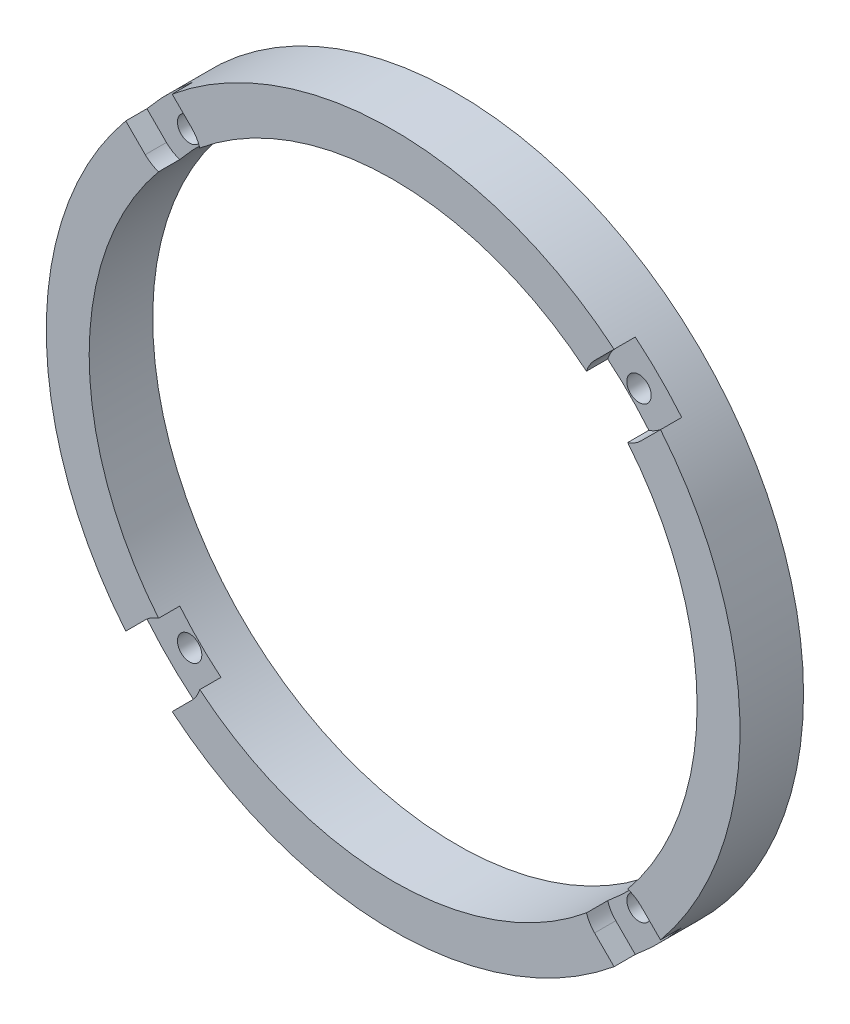
ISO-10303-21;
HEADER;
FILE_DESCRIPTION(('STEP AP214'),'2;1');
FILE_NAME('part.step','',(''),(''),'','','');
FILE_SCHEMA(('AUTOMOTIVE_DESIGN { 1 0 10303 214 1 1 1 1 }'));
ENDSEC;
DATA;
#1=APPLICATION_CONTEXT('core data for automotive mechanical design processes');
#2=APPLICATION_PROTOCOL_DEFINITION('international standard','automotive_design',2000,#1);
#3=PRODUCT_CONTEXT('',#1,'mechanical');
#4=PRODUCT('Part','Part','',(#3));
#5=PRODUCT_RELATED_PRODUCT_CATEGORY('part','',(#4));
#6=PRODUCT_DEFINITION_FORMATION('','',#4);
#7=PRODUCT_DEFINITION_CONTEXT('part definition',#1,'design');
#8=PRODUCT_DEFINITION('design','',#6,#7);
#9=PRODUCT_DEFINITION_SHAPE('','',#8);
#10=(LENGTH_UNIT() NAMED_UNIT(*) SI_UNIT(.MILLI.,.METRE.));
#11=(NAMED_UNIT(*) PLANE_ANGLE_UNIT() SI_UNIT($,.RADIAN.));
#12=(NAMED_UNIT(*) SI_UNIT($,.STERADIAN.) SOLID_ANGLE_UNIT());
#13=UNCERTAINTY_MEASURE_WITH_UNIT(LENGTH_MEASURE(1.E-05),#10,'distance_accuracy_value','');
#14=(GEOMETRIC_REPRESENTATION_CONTEXT(3) GLOBAL_UNCERTAINTY_ASSIGNED_CONTEXT((#13)) GLOBAL_UNIT_ASSIGNED_CONTEXT((#10,
#11,#12)) REPRESENTATION_CONTEXT('',''));
#15=CARTESIAN_POINT('',(0.,0.,0.));
#16=DIRECTION('',(0.,0.,1.));
#17=DIRECTION('',(1.,0.,0.));
#18=AXIS2_PLACEMENT_3D('',#15,#16,#17);
#19=CARTESIAN_POINT('',(0.,0.,6.));
#20=DIRECTION('',(0.,0.,-1.));
#21=DIRECTION('',(-1.,0.,0.));
#22=AXIS2_PLACEMENT_3D('',#19,#20,#21);
#23=CYLINDRICAL_SURFACE('',#22,32.75);
#24=CARTESIAN_POINT('',(0.,0.,0.));
#25=DIRECTION('',(0.,0.,1.));
#26=DIRECTION('',(1.,0.,0.));
#27=AXIS2_PLACEMENT_3D('',#24,#25,#26);
#28=CIRCLE('',#27,32.75);
#29=CARTESIAN_POINT('',(32.75,0.,0.));
#30=VERTEX_POINT('',#29);
#31=EDGE_CURVE('E385',#30,#30,#28,.T.);
#32=ORIENTED_EDGE('',*,*,#31,.T.);
#33=EDGE_LOOP('',(#32));
#34=FACE_BOUND('',#33,.T.);
#35=DIRECTION('',(0.,0.,1.));
#36=VECTOR('',#35,1.);
#37=CARTESIAN_POINT('',(-25.2457996940668,20.8617376507102,4.));
#38=LINE('',#37,#36);
#39=CARTESIAN_POINT('',(-25.2457996940668,20.8617376507102,4.));
#40=VERTEX_POINT('',#39);
#41=CARTESIAN_POINT('',(-25.2457996940668,20.8617376507102,6.));
#42=VERTEX_POINT('',#41);
#43=EDGE_CURVE('E311',#40,#42,#38,.T.);
#44=ORIENTED_EDGE('',*,*,#43,.F.);
#45=CARTESIAN_POINT('',(0.,0.,4.));
#46=DIRECTION('',(0.,0.,1.));
#47=DIRECTION('',(1.,0.,0.));
#48=AXIS2_PLACEMENT_3D('',#45,#46,#47);
#49=CIRCLE('',#48,32.75);
#50=CARTESIAN_POINT('',(-20.8617376507102,25.2457996940668,4.));
#51=VERTEX_POINT('',#50);
#52=EDGE_CURVE('E297',#51,#40,#49,.T.);
#53=ORIENTED_EDGE('',*,*,#52,.F.);
#54=DIRECTION('',(0.,0.,1.));
#55=VECTOR('',#54,1.);
#56=CARTESIAN_POINT('',(-20.8617376507102,25.2457996940668,4.));
#57=LINE('',#56,#55);
#58=CARTESIAN_POINT('',(-20.8617376507102,25.2457996940668,6.));
#59=VERTEX_POINT('',#58);
#60=EDGE_CURVE('E314',#51,#59,#57,.T.);
#61=ORIENTED_EDGE('',*,*,#60,.T.);
#62=CARTESIAN_POINT('',(0.,0.,6.));
#63=DIRECTION('',(0.,0.,1.));
#64=DIRECTION('',(1.,0.,0.));
#65=AXIS2_PLACEMENT_3D('',#62,#63,#64);
#66=CIRCLE('',#65,32.75);
#67=CARTESIAN_POINT('',(20.8617376507095,25.2457996940673,6.));
#68=VERTEX_POINT('',#67);
#69=EDGE_CURVE('E392',#68,#59,#66,.T.);
#70=ORIENTED_EDGE('',*,*,#69,.F.);
#71=DIRECTION('',(0.,0.,1.));
#72=VECTOR('',#71,1.);
#73=CARTESIAN_POINT('',(20.8617376507095,25.2457996940673,4.));
#74=LINE('',#73,#72);
#75=CARTESIAN_POINT('',(20.8617376507095,25.2457996940673,4.));
#76=VERTEX_POINT('',#75);
#77=EDGE_CURVE('E343',#76,#68,#74,.T.);
#78=ORIENTED_EDGE('',*,*,#77,.F.);
#79=CARTESIAN_POINT('',(0.,0.,4.));
#80=DIRECTION('',(0.,0.,1.));
#81=DIRECTION('',(1.,0.,0.));
#82=AXIS2_PLACEMENT_3D('',#79,#80,#81);
#83=CIRCLE('',#82,32.75);
#84=CARTESIAN_POINT('',(25.2457996940662,20.8617376507108,4.));
#85=VERTEX_POINT('',#84);
#86=EDGE_CURVE('E331',#85,#76,#83,.T.);
#87=ORIENTED_EDGE('',*,*,#86,.F.);
#88=DIRECTION('',(0.,0.,1.));
#89=VECTOR('',#88,1.);
#90=CARTESIAN_POINT('',(25.2457996940662,20.8617376507108,4.));
#91=LINE('',#90,#89);
#92=CARTESIAN_POINT('',(25.2457996940662,20.8617376507108,6.));
#93=VERTEX_POINT('',#92);
#94=EDGE_CURVE('E346',#85,#93,#91,.T.);
#95=ORIENTED_EDGE('',*,*,#94,.T.);
#96=CARTESIAN_POINT('',(25.2457996940679,-20.8617376507089,6.));
#97=VERTEX_POINT('',#96);
#98=EDGE_CURVE('E387',#97,#93,#66,.T.);
#99=ORIENTED_EDGE('',*,*,#98,.F.);
#100=DIRECTION('',(0.,0.,1.));
#101=VECTOR('',#100,1.);
#102=CARTESIAN_POINT('',(25.2457996940679,-20.8617376507089,4.));
#103=LINE('',#102,#101);
#104=CARTESIAN_POINT('',(25.2457996940679,-20.8617376507089,4.));
#105=VERTEX_POINT('',#104);
#106=EDGE_CURVE('E249',#105,#97,#103,.T.);
#107=ORIENTED_EDGE('',*,*,#106,.F.);
#108=CARTESIAN_POINT('',(0.,0.,4.));
#109=DIRECTION('',(0.,0.,1.));
#110=DIRECTION('',(1.,0.,0.));
#111=AXIS2_PLACEMENT_3D('',#108,#109,#110);
#112=CIRCLE('',#111,32.75);
#113=CARTESIAN_POINT('',(20.8617376507115,-25.2457996940657,4.));
#114=VERTEX_POINT('',#113);
#115=EDGE_CURVE('E235',#114,#105,#112,.T.);
#116=ORIENTED_EDGE('',*,*,#115,.F.);
#117=DIRECTION('',(0.,0.,1.));
#118=VECTOR('',#117,1.);
#119=CARTESIAN_POINT('',(20.8617376507115,-25.2457996940657,4.));
#120=LINE('',#119,#118);
#121=CARTESIAN_POINT('',(20.8617376507115,-25.2457996940657,6.));
#122=VERTEX_POINT('',#121);
#123=EDGE_CURVE('E230',#114,#122,#120,.T.);
#124=ORIENTED_EDGE('',*,*,#123,.T.);
#125=CARTESIAN_POINT('',(-20.8617376507095,-25.2457996940673,6.));
#126=VERTEX_POINT('',#125);
#127=EDGE_CURVE('E391',#126,#122,#66,.T.);
#128=ORIENTED_EDGE('',*,*,#127,.F.);
#129=DIRECTION('',(0.,0.,1.));
#130=VECTOR('',#129,1.);
#131=CARTESIAN_POINT('',(-20.8617376507095,-25.2457996940673,4.));
#132=LINE('',#131,#130);
#133=CARTESIAN_POINT('',(-20.8617376507095,-25.2457996940673,4.));
#134=VERTEX_POINT('',#133);
#135=EDGE_CURVE('E277',#134,#126,#132,.T.);
#136=ORIENTED_EDGE('',*,*,#135,.F.);
#137=CARTESIAN_POINT('',(0.,0.,4.));
#138=DIRECTION('',(0.,0.,1.));
#139=DIRECTION('',(1.,0.,0.));
#140=AXIS2_PLACEMENT_3D('',#137,#138,#139);
#141=CIRCLE('',#140,32.75);
#142=CARTESIAN_POINT('',(-25.2457996940662,-20.8617376507108,4.));
#143=VERTEX_POINT('',#142);
#144=EDGE_CURVE('E266',#143,#134,#141,.T.);
#145=ORIENTED_EDGE('',*,*,#144,.F.);
#146=DIRECTION('',(0.,0.,1.));
#147=VECTOR('',#146,1.);
#148=CARTESIAN_POINT('',(-25.2457996940662,-20.8617376507108,4.));
#149=LINE('',#148,#147);
#150=CARTESIAN_POINT('',(-25.2457996940662,-20.8617376507108,6.));
#151=VERTEX_POINT('',#150);
#152=EDGE_CURVE('E280',#143,#151,#149,.T.);
#153=ORIENTED_EDGE('',*,*,#152,.T.);
#154=EDGE_CURVE('E529',#42,#151,#66,.T.);
#155=ORIENTED_EDGE('',*,*,#154,.F.);
#156=EDGE_LOOP('',(#44,#53,#61,#70,#78,#87,#95,#99,#107,#116,#124,#128,#136,#145,#153,#155));
#157=FACE_BOUND('',#156,.T.);
#158=ADVANCED_FACE('F47',(#34,#157),#23,.T.);
#159=CARTESIAN_POINT('',(0.,0.,6.));
#160=DIRECTION('',(0.,0.,1.));
#161=DIRECTION('',(1.,0.,0.));
#162=AXIS2_PLACEMENT_3D('',#159,#160,#161);
#163=PLANE('',#162);
#164=CARTESIAN_POINT('',(-21.2132615180016,21.2132615180016,6.));
#165=DIRECTION('',(0.,0.,1.));
#166=DIRECTION('',(1.,0.,0.));
#167=AXIS2_PLACEMENT_3D('',#164,#165,#166);
#168=CIRCLE('',#167,3.1);
#169=CARTESIAN_POINT('',(-23.4052925396799,19.0212304963233,6.));
#170=VERTEX_POINT('',#169);
#171=CARTESIAN_POINT('',(-22.1447424592939,18.2565161356582,6.));
#172=VERTEX_POINT('',#171);
#173=EDGE_CURVE('E11',#170,#172,#168,.T.);
#174=ORIENTED_EDGE('',*,*,#173,.F.);
#175=DIRECTION('',(-0.707106781186547,0.707106781186548,0.));
#176=VECTOR('',#175,1.);
#177=CARTESIAN_POINT('',(-2.19203102167832,-2.19203102167832,6.));
#178=LINE('',#177,#176);
#179=EDGE_CURVE('E57',#170,#42,#178,.T.);
#180=ORIENTED_EDGE('',*,*,#179,.T.);
#181=ORIENTED_EDGE('',*,*,#154,.T.);
#182=DIRECTION('',(-0.707106781186548,-0.707106781186548,0.));
#183=VECTOR('',#182,1.);
#184=CARTESIAN_POINT('',(-2.1920310216777,2.1920310216777,6.));
#185=LINE('',#184,#183);
#186=CARTESIAN_POINT('',(-23.4052925416176,-19.0212304943844,6.));
#187=VERTEX_POINT('',#186);
#188=EDGE_CURVE('E427',#187,#151,#185,.T.);
#189=ORIENTED_EDGE('',*,*,#188,.F.);
#190=CARTESIAN_POINT('',(-21.2132615180004,-21.2132615180016,6.));
#191=DIRECTION('',(0.,0.,1.));
#192=DIRECTION('',(1.,0.,0.));
#193=AXIS2_PLACEMENT_3D('',#190,#191,#192);
#194=CIRCLE('',#193,3.10000000548412);
#195=CARTESIAN_POINT('',(-22.1447424630566,-18.2565161310941,6.));
#196=VERTEX_POINT('',#195);
#197=EDGE_CURVE('E424',#196,#187,#194,.T.);
#198=ORIENTED_EDGE('',*,*,#197,.F.);
#199=CARTESIAN_POINT('',(0.,0.,6.));
#200=DIRECTION('',(0.,0.,1.));
#201=DIRECTION('',(1.,0.,0.));
#202=AXIS2_PLACEMENT_3D('',#199,#200,#201);
#203=CIRCLE('',#202,28.7);
#204=EDGE_CURVE('E522',#172,#196,#203,.T.);
#205=ORIENTED_EDGE('',*,*,#204,.F.);
#206=EDGE_LOOP('',(#174,#180,#181,#189,#198,#205));
#207=FACE_BOUND('',#206,.T.);
#208=ADVANCED_FACE('F572',(#207),#163,.T.);
#209=CARTESIAN_POINT('',(-21.2132615180004,-21.2132615180016,6.));
#210=DIRECTION('',(0.,0.,1.));
#211=DIRECTION('',(1.,0.,0.));
#212=AXIS2_PLACEMENT_3D('',#209,#210,#211);
#213=CIRCLE('',#212,3.10000000548412);
#214=CARTESIAN_POINT('',(-19.0212304943832,-23.4052925416188,6.));
#215=VERTEX_POINT('',#214);
#216=CARTESIAN_POINT('',(-18.2565161310928,-22.1447424630576,6.));
#217=VERTEX_POINT('',#216);
#218=EDGE_CURVE('E434',#215,#217,#213,.T.);
#219=ORIENTED_EDGE('',*,*,#218,.F.);
#220=DIRECTION('',(-0.707106781186548,-0.707106781186547,0.));
#221=VECTOR('',#220,1.);
#222=CARTESIAN_POINT('',(2.19203102167891,-2.19203102167892,6.));
#223=LINE('',#222,#221);
#224=EDGE_CURVE('E430',#215,#126,#223,.T.);
#225=ORIENTED_EDGE('',*,*,#224,.T.);
#226=ORIENTED_EDGE('',*,*,#127,.T.);
#227=DIRECTION('',(0.707106781186547,-0.707106781186548,0.));
#228=VECTOR('',#227,1.);
#229=CARTESIAN_POINT('',(-2.19203102167708,-2.19203102167708,6.));
#230=LINE('',#229,#228);
#231=CARTESIAN_POINT('',(19.0212304963245,-23.4052925396787,6.));
#232=VERTEX_POINT('',#231);
#233=EDGE_CURVE('E414',#232,#122,#230,.T.);
#234=ORIENTED_EDGE('',*,*,#233,.F.);
#235=CARTESIAN_POINT('',(21.2132615180028,-21.2132615180004,6.));
#236=DIRECTION('',(0.,0.,1.));
#237=DIRECTION('',(1.,0.,0.));
#238=AXIS2_PLACEMENT_3D('',#235,#236,#237);
#239=CIRCLE('',#238,3.1);
#240=CARTESIAN_POINT('',(18.2565161356594,-22.1447424592929,6.));
#241=VERTEX_POINT('',#240);
#242=EDGE_CURVE('E226',#241,#232,#239,.T.);
#243=ORIENTED_EDGE('',*,*,#242,.F.);
#244=EDGE_CURVE('E384',#217,#241,#203,.T.);
#245=ORIENTED_EDGE('',*,*,#244,.F.);
#246=EDGE_LOOP('',(#219,#225,#226,#234,#243,#245));
#247=FACE_BOUND('',#246,.T.);
#248=ADVANCED_FACE('F577',(#247),#163,.T.);
#249=CARTESIAN_POINT('',(21.2132615180028,-21.2132615180004,6.));
#250=DIRECTION('',(0.,0.,1.));
#251=DIRECTION('',(1.,0.,0.));
#252=AXIS2_PLACEMENT_3D('',#249,#250,#251);
#253=CIRCLE('',#252,3.1);
#254=CARTESIAN_POINT('',(23.4052925396811,-19.0212304963221,6.));
#255=VERTEX_POINT('',#254);
#256=CARTESIAN_POINT('',(22.1447424592949,-18.2565161356569,6.));
#257=VERTEX_POINT('',#256);
#258=EDGE_CURVE('E421',#255,#257,#253,.T.);
#259=ORIENTED_EDGE('',*,*,#258,.F.);
#260=DIRECTION('',(0.707106781186547,-0.707106781186548,0.));
#261=VECTOR('',#260,1.);
#262=CARTESIAN_POINT('',(2.19203102167952,2.19203102167951,6.));
#263=LINE('',#262,#261);
#264=EDGE_CURVE('E417',#255,#97,#263,.T.);
#265=ORIENTED_EDGE('',*,*,#264,.T.);
#266=ORIENTED_EDGE('',*,*,#98,.T.);
#267=DIRECTION('',(0.707106781186548,0.707106781186547,0.));
#268=VECTOR('',#267,1.);
#269=CARTESIAN_POINT('',(2.19203102167768,-2.19203102167768,6.));
#270=LINE('',#269,#268);
#271=CARTESIAN_POINT('',(23.405292537741,19.0212304982634,6.));
#272=VERTEX_POINT('',#271);
#273=EDGE_CURVE('E402',#272,#93,#270,.T.);
#274=ORIENTED_EDGE('',*,*,#273,.F.);
#275=CARTESIAN_POINT('',(21.2132615180016,21.2132615180028,6.));
#276=DIRECTION('',(0.,0.,1.));
#277=DIRECTION('',(1.,0.,0.));
#278=AXIS2_PLACEMENT_3D('',#275,#276,#277);
#279=CIRCLE('',#278,3.09999999451588);
#280=CARTESIAN_POINT('',(22.1447424555302,18.2565161402235,6.));
#281=VERTEX_POINT('',#280);
#282=EDGE_CURVE('E399',#281,#272,#279,.T.);
#283=ORIENTED_EDGE('',*,*,#282,.F.);
#284=EDGE_CURVE('E380',#257,#281,#203,.T.);
#285=ORIENTED_EDGE('',*,*,#284,.F.);
#286=EDGE_LOOP('',(#259,#265,#266,#274,#283,#285));
#287=FACE_BOUND('',#286,.T.);
#288=ADVANCED_FACE('F509',(#287),#163,.T.);
#289=CARTESIAN_POINT('',(0.,0.,6.));
#290=DIRECTION('',(0.,0.,-1.));
#291=DIRECTION('',(-1.,0.,0.));
#292=AXIS2_PLACEMENT_3D('',#289,#290,#291);
#293=CYLINDRICAL_SURFACE('',#292,28.7);
#294=DIRECTION('',(0.,0.,1.));
#295=VECTOR('',#294,1.);
#296=CARTESIAN_POINT('',(-22.1447424592939,18.2565161356582,5.));
#297=LINE('',#296,#295);
#298=CARTESIAN_POINT('',(-22.1447424592939,18.2565161356582,4.));
#299=VERTEX_POINT('',#298);
#300=EDGE_CURVE('E375',#172,#299,#297,.F.);
#301=ORIENTED_EDGE('',*,*,#300,.F.);
#302=ORIENTED_EDGE('',*,*,#204,.T.);
#303=DIRECTION('',(0.,0.,1.));
#304=VECTOR('',#303,1.);
#305=CARTESIAN_POINT('',(-22.1447424630566,-18.2565161310941,5.));
#306=LINE('',#305,#304);
#307=CARTESIAN_POINT('',(-22.1447424630566,-18.2565161310941,4.));
#308=VERTEX_POINT('',#307);
#309=EDGE_CURVE('E73',#308,#196,#306,.T.);
#310=ORIENTED_EDGE('',*,*,#309,.F.);
#311=CARTESIAN_POINT('',(0.,0.,4.));
#312=DIRECTION('',(0.,0.,1.));
#313=DIRECTION('',(1.,0.,0.));
#314=AXIS2_PLACEMENT_3D('',#311,#312,#313);
#315=CIRCLE('',#314,28.7);
#316=CARTESIAN_POINT('',(-18.2565161310928,-22.1447424630576,4.));
#317=VERTEX_POINT('',#316);
#318=EDGE_CURVE('E254',#317,#308,#315,.F.);
#319=ORIENTED_EDGE('',*,*,#318,.F.);
#320=DIRECTION('',(0.,0.,1.));
#321=VECTOR('',#320,1.);
#322=CARTESIAN_POINT('',(-18.2565161310928,-22.1447424630576,5.));
#323=LINE('',#322,#321);
#324=EDGE_CURVE('E368',#217,#317,#323,.F.);
#325=ORIENTED_EDGE('',*,*,#324,.F.);
#326=ORIENTED_EDGE('',*,*,#244,.T.);
#327=DIRECTION('',(0.,0.,1.));
#328=VECTOR('',#327,1.);
#329=CARTESIAN_POINT('',(18.2565161356594,-22.1447424592929,5.));
#330=LINE('',#329,#328);
#331=CARTESIAN_POINT('',(18.2565161356594,-22.1447424592929,4.));
#332=VERTEX_POINT('',#331);
#333=EDGE_CURVE('E65',#332,#241,#330,.T.);
#334=ORIENTED_EDGE('',*,*,#333,.F.);
#335=CARTESIAN_POINT('',(0.,0.,4.));
#336=DIRECTION('',(0.,0.,1.));
#337=DIRECTION('',(1.,0.,0.));
#338=AXIS2_PLACEMENT_3D('',#335,#336,#337);
#339=CIRCLE('',#338,28.7);
#340=CARTESIAN_POINT('',(22.1447424592949,-18.2565161356569,4.));
#341=VERTEX_POINT('',#340);
#342=EDGE_CURVE('E219',#341,#332,#339,.F.);
#343=ORIENTED_EDGE('',*,*,#342,.F.);
#344=DIRECTION('',(0.,0.,1.));
#345=VECTOR('',#344,1.);
#346=CARTESIAN_POINT('',(22.1447424592949,-18.2565161356569,5.));
#347=LINE('',#346,#345);
#348=EDGE_CURVE('E362',#257,#341,#347,.F.);
#349=ORIENTED_EDGE('',*,*,#348,.F.);
#350=ORIENTED_EDGE('',*,*,#284,.T.);
#351=DIRECTION('',(0.,0.,1.));
#352=VECTOR('',#351,1.);
#353=CARTESIAN_POINT('',(22.1447424555302,18.2565161402235,5.));
#354=LINE('',#353,#352);
#355=CARTESIAN_POINT('',(22.1447424555302,18.2565161402235,4.));
#356=VERTEX_POINT('',#355);
#357=EDGE_CURVE('E342',#356,#281,#354,.T.);
#358=ORIENTED_EDGE('',*,*,#357,.F.);
#359=CARTESIAN_POINT('',(0.,0.,4.));
#360=DIRECTION('',(0.,0.,1.));
#361=DIRECTION('',(1.,0.,0.));
#362=AXIS2_PLACEMENT_3D('',#359,#360,#361);
#363=CIRCLE('',#362,28.7);
#364=CARTESIAN_POINT('',(18.2565161402222,22.1447424555312,4.));
#365=VERTEX_POINT('',#364);
#366=EDGE_CURVE('E248',#365,#356,#363,.F.);
#367=ORIENTED_EDGE('',*,*,#366,.F.);
#368=DIRECTION('',(0.,0.,1.));
#369=VECTOR('',#368,1.);
#370=CARTESIAN_POINT('',(18.2565161402222,22.1447424555312,6.));
#371=LINE('',#370,#369);
#372=CARTESIAN_POINT('',(18.2565161402222,22.1447424555312,6.));
#373=VERTEX_POINT('',#372);
#374=EDGE_CURVE('E356',#373,#365,#371,.F.);
#375=ORIENTED_EDGE('',*,*,#374,.F.);
#376=CARTESIAN_POINT('',(-18.2565161356582,22.1447424592939,6.));
#377=VERTEX_POINT('',#376);
#378=EDGE_CURVE('E386',#373,#377,#203,.T.);
#379=ORIENTED_EDGE('',*,*,#378,.T.);
#380=DIRECTION('',(0.,0.,1.));
#381=VECTOR('',#380,1.);
#382=CARTESIAN_POINT('',(-18.2565161356582,22.1447424592939,6.));
#383=LINE('',#382,#381);
#384=CARTESIAN_POINT('',(-18.2565161356582,22.1447424592939,4.));
#385=VERTEX_POINT('',#384);
#386=EDGE_CURVE('E372',#385,#377,#383,.T.);
#387=ORIENTED_EDGE('',*,*,#386,.F.);
#388=CARTESIAN_POINT('',(0.,0.,4.));
#389=DIRECTION('',(0.,0.,1.));
#390=DIRECTION('',(1.,0.,0.));
#391=AXIS2_PLACEMENT_3D('',#388,#389,#390);
#392=CIRCLE('',#391,28.7);
#393=EDGE_CURVE('E304',#299,#385,#392,.F.);
#394=ORIENTED_EDGE('',*,*,#393,.F.);
#395=EDGE_LOOP('',(#301,#302,#310,#319,#325,#326,#334,#343,#349,#350,#358,#367,#375,#379,#387,#394));
#396=FACE_BOUND('',#395,.T.);
#397=CARTESIAN_POINT('',(0.,0.,0.));
#398=DIRECTION('',(0.,0.,1.));
#399=DIRECTION('',(1.,0.,0.));
#400=AXIS2_PLACEMENT_3D('',#397,#398,#399);
#401=CIRCLE('',#400,28.7);
#402=CARTESIAN_POINT('',(28.7,0.,0.));
#403=VERTEX_POINT('',#402);
#404=EDGE_CURVE('E379',#403,#403,#401,.T.);
#405=ORIENTED_EDGE('',*,*,#404,.F.);
#406=EDGE_LOOP('',(#405));
#407=FACE_BOUND('',#406,.T.);
#408=ADVANCED_FACE('F49',(#396,#407),#293,.F.);
#409=DIRECTION('',(-0.707106781186547,0.707106781186548,0.));
#410=VECTOR('',#409,1.);
#411=CARTESIAN_POINT('',(2.19203102167828,2.19203102167828,6.));
#412=LINE('',#411,#410);
#413=CARTESIAN_POINT('',(-19.0212304963233,23.4052925396799,6.));
#414=VERTEX_POINT('',#413);
#415=EDGE_CURVE('E440',#414,#59,#412,.T.);
#416=ORIENTED_EDGE('',*,*,#415,.F.);
#417=CARTESIAN_POINT('',(-21.2132615180016,21.2132615180016,6.));
#418=DIRECTION('',(0.,0.,1.));
#419=DIRECTION('',(1.,0.,0.));
#420=AXIS2_PLACEMENT_3D('',#417,#418,#419);
#421=CIRCLE('',#420,3.1);
#422=EDGE_CURVE('E437',#377,#414,#421,.T.);
#423=ORIENTED_EDGE('',*,*,#422,.F.);
#424=ORIENTED_EDGE('',*,*,#378,.F.);
#425=CARTESIAN_POINT('',(21.2132615180016,21.2132615180028,6.));
#426=DIRECTION('',(0.,0.,1.));
#427=DIRECTION('',(1.,0.,0.));
#428=AXIS2_PLACEMENT_3D('',#425,#426,#427);
#429=CIRCLE('',#428,3.09999999451588);
#430=CARTESIAN_POINT('',(19.0212304982622,23.4052925377422,6.));
#431=VERTEX_POINT('',#430);
#432=EDGE_CURVE('E409',#431,#373,#429,.T.);
#433=ORIENTED_EDGE('',*,*,#432,.F.);
#434=DIRECTION('',(0.707106781186548,0.707106781186547,0.));
#435=VECTOR('',#434,1.);
#436=CARTESIAN_POINT('',(-2.19203102167891,2.19203102167892,6.));
#437=LINE('',#436,#435);
#438=EDGE_CURVE('E405',#431,#68,#437,.T.);
#439=ORIENTED_EDGE('',*,*,#438,.T.);
#440=ORIENTED_EDGE('',*,*,#69,.T.);
#441=EDGE_LOOP('',(#416,#423,#424,#433,#439,#440));
#442=FACE_BOUND('',#441,.T.);
#443=ADVANCED_FACE('F536',(#442),#163,.T.);
#444=CARTESIAN_POINT('',(0.,0.,0.));
#445=DIRECTION('',(0.,0.,1.));
#446=DIRECTION('',(1.,0.,0.));
#447=AXIS2_PLACEMENT_3D('',#444,#445,#446);
#448=PLANE('',#447);
#449=CARTESIAN_POINT('',(21.2132615180014,-21.2132615180018,0.));
#450=DIRECTION('',(0.,0.,1.));
#451=DIRECTION('',(1.,0.,0.));
#452=AXIS2_PLACEMENT_3D('',#449,#450,#451);
#453=CIRCLE('',#452,1.15000000291596);
#454=CARTESIAN_POINT('',(22.3632615209174,-21.2132615180018,0.));
#455=VERTEX_POINT('',#454);
#456=EDGE_CURVE('E458',#455,#455,#453,.T.);
#457=ORIENTED_EDGE('',*,*,#456,.T.);
#458=EDGE_LOOP('',(#457));
#459=FACE_BOUND('',#458,.T.);
#460=CARTESIAN_POINT('',(21.2132615180017,21.2132615180015,0.));
#461=DIRECTION('',(0.,0.,1.));
#462=DIRECTION('',(1.,0.,0.));
#463=AXIS2_PLACEMENT_3D('',#460,#461,#462);
#464=CIRCLE('',#463,1.15000000291596);
#465=CARTESIAN_POINT('',(22.3632615209176,21.2132615180015,0.));
#466=VERTEX_POINT('',#465);
#467=EDGE_CURVE('E292',#466,#466,#464,.T.);
#468=ORIENTED_EDGE('',*,*,#467,.T.);
#469=EDGE_LOOP('',(#468));
#470=FACE_BOUND('',#469,.T.);
#471=CARTESIAN_POINT('',(-21.2132615180016,21.2132615180016,0.));
#472=DIRECTION('',(0.,0.,1.));
#473=DIRECTION('',(1.,0.,0.));
#474=AXIS2_PLACEMENT_3D('',#471,#472,#473);
#475=CIRCLE('',#474,1.15000000291596);
#476=CARTESIAN_POINT('',(-20.0632615150856,21.2132615180016,0.));
#477=VERTEX_POINT('',#476);
#478=EDGE_CURVE('E450',#477,#477,#475,.T.);
#479=ORIENTED_EDGE('',*,*,#478,.T.);
#480=EDGE_LOOP('',(#479));
#481=FACE_BOUND('',#480,.T.);
#482=CARTESIAN_POINT('',(-21.2132615180018,-21.2132615180014,0.));
#483=DIRECTION('',(0.,0.,1.));
#484=DIRECTION('',(1.,0.,0.));
#485=AXIS2_PLACEMENT_3D('',#482,#483,#484);
#486=CIRCLE('',#485,1.15000000291596);
#487=CARTESIAN_POINT('',(-20.0632615150859,-21.2132615180014,0.));
#488=VERTEX_POINT('',#487);
#489=EDGE_CURVE('E454',#488,#488,#486,.T.);
#490=ORIENTED_EDGE('',*,*,#489,.T.);
#491=EDGE_LOOP('',(#490));
#492=FACE_BOUND('',#491,.T.);
#493=ORIENTED_EDGE('',*,*,#404,.T.);
#494=EDGE_LOOP('',(#493));
#495=FACE_BOUND('',#494,.T.);
#496=ORIENTED_EDGE('',*,*,#31,.F.);
#497=EDGE_LOOP('',(#496));
#498=FACE_BOUND('',#497,.T.);
#499=ADVANCED_FACE('F569',(#459,#470,#481,#492,#495,#498),#448,.F.);
#500=CARTESIAN_POINT('',(21.2132615180016,21.2132615180028,4.));
#501=DIRECTION('',(0.,0.,1.));
#502=DIRECTION('',(1.,0.,0.));
#503=AXIS2_PLACEMENT_3D('',#500,#501,#502);
#504=CYLINDRICAL_SURFACE('',#503,3.09999999451588);
#505=ORIENTED_EDGE('',*,*,#374,.T.);
#506=CARTESIAN_POINT('',(21.2132615180016,21.2132615180028,4.));
#507=DIRECTION('',(0.,0.,1.));
#508=DIRECTION('',(1.,0.,0.));
#509=AXIS2_PLACEMENT_3D('',#506,#507,#508);
#510=CIRCLE('',#509,3.09999999451588);
#511=CARTESIAN_POINT('',(19.0212304982622,23.4052925377422,4.));
#512=VERTEX_POINT('',#511);
#513=EDGE_CURVE('E327',#512,#365,#510,.T.);
#514=ORIENTED_EDGE('',*,*,#513,.F.);
#515=DIRECTION('',(0.,0.,1.));
#516=VECTOR('',#515,1.);
#517=CARTESIAN_POINT('',(19.0212304982622,23.4052925377422,4.));
#518=LINE('',#517,#516);
#519=EDGE_CURVE('E338',#512,#431,#518,.T.);
#520=ORIENTED_EDGE('',*,*,#519,.T.);
#521=ORIENTED_EDGE('',*,*,#432,.T.);
#522=EDGE_LOOP('',(#505,#514,#520,#521));
#523=FACE_BOUND('',#522,.T.);
#524=ADVANCED_FACE('F558',(#523),#504,.F.);
#525=CARTESIAN_POINT('',(-2.19203102167891,2.19203102167892,4.));
#526=DIRECTION('',(0.707106781186547,-0.707106781186548,0.));
#527=DIRECTION('',(0.707106781186548,0.707106781186547,0.));
#528=AXIS2_PLACEMENT_3D('',#525,#526,#527);
#529=PLANE('',#528);
#530=ORIENTED_EDGE('',*,*,#519,.F.);
#531=DIRECTION('',(0.707106781186548,0.707106781186547,0.));
#532=VECTOR('',#531,1.);
#533=CARTESIAN_POINT('',(-2.19203102167891,2.19203102167892,4.));
#534=LINE('',#533,#532);
#535=EDGE_CURVE('E335',#512,#76,#534,.T.);
#536=ORIENTED_EDGE('',*,*,#535,.T.);
#537=ORIENTED_EDGE('',*,*,#77,.T.);
#538=ORIENTED_EDGE('',*,*,#438,.F.);
#539=EDGE_LOOP('',(#530,#536,#537,#538));
#540=FACE_BOUND('',#539,.T.);
#541=ADVANCED_FACE('F561',(#540),#529,.T.);
#542=CARTESIAN_POINT('',(2.19203102167768,-2.19203102167768,4.));
#543=DIRECTION('',(0.707106781186547,-0.707106781186548,0.));
#544=DIRECTION('',(0.707106781186548,0.707106781186547,0.));
#545=AXIS2_PLACEMENT_3D('',#542,#543,#544);
#546=PLANE('',#545);
#547=ORIENTED_EDGE('',*,*,#273,.T.);
#548=ORIENTED_EDGE('',*,*,#94,.F.);
#549=DIRECTION('',(0.707106781186548,0.707106781186547,0.));
#550=VECTOR('',#549,1.);
#551=CARTESIAN_POINT('',(2.19203102167768,-2.19203102167768,4.));
#552=LINE('',#551,#550);
#553=CARTESIAN_POINT('',(23.405292537741,19.0212304982634,4.));
#554=VERTEX_POINT('',#553);
#555=EDGE_CURVE('E326',#554,#85,#552,.T.);
#556=ORIENTED_EDGE('',*,*,#555,.F.);
#557=DIRECTION('',(0.,0.,1.));
#558=VECTOR('',#557,1.);
#559=CARTESIAN_POINT('',(23.405292537741,19.0212304982634,4.));
#560=LINE('',#559,#558);
#561=EDGE_CURVE('E350',#554,#272,#560,.T.);
#562=ORIENTED_EDGE('',*,*,#561,.T.);
#563=EDGE_LOOP('',(#547,#548,#556,#562));
#564=FACE_BOUND('',#563,.T.);
#565=ADVANCED_FACE('F501',(#564),#546,.F.);
#566=ORIENTED_EDGE('',*,*,#357,.T.);
#567=ORIENTED_EDGE('',*,*,#282,.T.);
#568=ORIENTED_EDGE('',*,*,#561,.F.);
#569=EDGE_CURVE('E323',#356,#554,#510,.T.);
#570=ORIENTED_EDGE('',*,*,#569,.F.);
#571=EDGE_LOOP('',(#566,#567,#568,#570));
#572=FACE_BOUND('',#571,.T.);
#573=ADVANCED_FACE('F489',(#572),#504,.F.);
#574=CARTESIAN_POINT('',(0.,0.,4.));
#575=DIRECTION('',(0.,0.,1.));
#576=DIRECTION('',(1.,0.,0.));
#577=AXIS2_PLACEMENT_3D('',#574,#575,#576);
#578=PLANE('',#577);
#579=CARTESIAN_POINT('',(21.2132615180017,21.2132615180015,4.));
#580=DIRECTION('',(0.,0.,1.));
#581=DIRECTION('',(1.,0.,0.));
#582=AXIS2_PLACEMENT_3D('',#579,#580,#581);
#583=CIRCLE('',#582,1.15000000291596);
#584=CARTESIAN_POINT('',(22.3632615209176,21.2132615180015,4.));
#585=VERTEX_POINT('',#584);
#586=EDGE_CURVE('E51',#585,#585,#583,.T.);
#587=ORIENTED_EDGE('',*,*,#586,.F.);
#588=EDGE_LOOP('',(#587));
#589=FACE_BOUND('',#588,.T.);
#590=ORIENTED_EDGE('',*,*,#569,.T.);
#591=ORIENTED_EDGE('',*,*,#555,.T.);
#592=ORIENTED_EDGE('',*,*,#86,.T.);
#593=ORIENTED_EDGE('',*,*,#535,.F.);
#594=ORIENTED_EDGE('',*,*,#513,.T.);
#595=ORIENTED_EDGE('',*,*,#366,.T.);
#596=EDGE_LOOP('',(#590,#591,#592,#593,#594,#595));
#597=FACE_BOUND('',#596,.T.);
#598=ADVANCED_FACE('F485',(#589,#597),#578,.T.);
#599=CARTESIAN_POINT('',(21.2132615180028,-21.2132615180004,4.));
#600=DIRECTION('',(0.,0.,1.));
#601=DIRECTION('',(1.,0.,0.));
#602=AXIS2_PLACEMENT_3D('',#599,#600,#601);
#603=CYLINDRICAL_SURFACE('',#602,3.1);
#604=ORIENTED_EDGE('',*,*,#348,.T.);
#605=CARTESIAN_POINT('',(21.2132615180028,-21.2132615180004,4.));
#606=DIRECTION('',(0.,0.,1.));
#607=DIRECTION('',(1.,0.,0.));
#608=AXIS2_PLACEMENT_3D('',#605,#606,#607);
#609=CIRCLE('',#608,3.1);
#610=CARTESIAN_POINT('',(23.4052925396811,-19.0212304963221,4.));
#611=VERTEX_POINT('',#610);
#612=EDGE_CURVE('E222',#611,#341,#609,.T.);
#613=ORIENTED_EDGE('',*,*,#612,.F.);
#614=DIRECTION('',(0.,0.,1.));
#615=VECTOR('',#614,1.);
#616=CARTESIAN_POINT('',(23.4052925396811,-19.0212304963221,4.));
#617=LINE('',#616,#615);
#618=EDGE_CURVE('E244',#611,#255,#617,.T.);
#619=ORIENTED_EDGE('',*,*,#618,.T.);
#620=ORIENTED_EDGE('',*,*,#258,.T.);
#621=EDGE_LOOP('',(#604,#613,#619,#620));
#622=FACE_BOUND('',#621,.T.);
#623=ADVANCED_FACE('F488',(#622),#603,.F.);
#624=CARTESIAN_POINT('',(2.19203102167952,2.19203102167951,4.));
#625=DIRECTION('',(-0.707106781186548,-0.707106781186547,0.));
#626=DIRECTION('',(0.707106781186547,-0.707106781186548,0.));
#627=AXIS2_PLACEMENT_3D('',#624,#625,#626);
#628=PLANE('',#627);
#629=ORIENTED_EDGE('',*,*,#618,.F.);
#630=DIRECTION('',(0.707106781186547,-0.707106781186548,0.));
#631=VECTOR('',#630,1.);
#632=CARTESIAN_POINT('',(2.19203102167952,2.19203102167951,4.));
#633=LINE('',#632,#631);
#634=EDGE_CURVE('E238',#611,#105,#633,.T.);
#635=ORIENTED_EDGE('',*,*,#634,.T.);
#636=ORIENTED_EDGE('',*,*,#106,.T.);
#637=ORIENTED_EDGE('',*,*,#264,.F.);
#638=EDGE_LOOP('',(#629,#635,#636,#637));
#639=FACE_BOUND('',#638,.T.);
#640=ADVANCED_FACE('F512',(#639),#628,.T.);
#641=CARTESIAN_POINT('',(-2.19203102167708,-2.19203102167708,4.));
#642=DIRECTION('',(-0.707106781186548,-0.707106781186547,0.));
#643=DIRECTION('',(0.707106781186547,-0.707106781186548,0.));
#644=AXIS2_PLACEMENT_3D('',#641,#642,#643);
#645=PLANE('',#644);
#646=ORIENTED_EDGE('',*,*,#233,.T.);
#647=ORIENTED_EDGE('',*,*,#123,.F.);
#648=DIRECTION('',(0.707106781186547,-0.707106781186548,0.));
#649=VECTOR('',#648,1.);
#650=CARTESIAN_POINT('',(-2.19203102167708,-2.19203102167708,4.));
#651=LINE('',#650,#649);
#652=CARTESIAN_POINT('',(19.0212304963245,-23.4052925396787,4.));
#653=VERTEX_POINT('',#652);
#654=EDGE_CURVE('E216',#653,#114,#651,.T.);
#655=ORIENTED_EDGE('',*,*,#654,.F.);
#656=DIRECTION('',(0.,0.,1.));
#657=VECTOR('',#656,1.);
#658=CARTESIAN_POINT('',(19.0212304963245,-23.4052925396787,4.));
#659=LINE('',#658,#657);
#660=EDGE_CURVE('E224',#653,#232,#659,.T.);
#661=ORIENTED_EDGE('',*,*,#660,.T.);
#662=EDGE_LOOP('',(#646,#647,#655,#661));
#663=FACE_BOUND('',#662,.T.);
#664=ADVANCED_FACE('F232',(#663),#645,.F.);
#665=ORIENTED_EDGE('',*,*,#333,.T.);
#666=ORIENTED_EDGE('',*,*,#242,.T.);
#667=ORIENTED_EDGE('',*,*,#660,.F.);
#668=EDGE_CURVE('E211',#332,#653,#609,.T.);
#669=ORIENTED_EDGE('',*,*,#668,.F.);
#670=EDGE_LOOP('',(#665,#666,#667,#669));
#671=FACE_BOUND('',#670,.T.);
#672=ADVANCED_FACE('F225',(#671),#603,.F.);
#673=CARTESIAN_POINT('',(0.,0.,4.));
#674=DIRECTION('',(0.,0.,1.));
#675=DIRECTION('',(1.,0.,0.));
#676=AXIS2_PLACEMENT_3D('',#673,#674,#675);
#677=PLANE('',#676);
#678=CARTESIAN_POINT('',(21.2132615180014,-21.2132615180018,4.));
#679=DIRECTION('',(0.,0.,1.));
#680=DIRECTION('',(1.,0.,0.));
#681=AXIS2_PLACEMENT_3D('',#678,#679,#680);
#682=CIRCLE('',#681,1.15000000291596);
#683=CARTESIAN_POINT('',(22.3632615209174,-21.2132615180018,4.));
#684=VERTEX_POINT('',#683);
#685=EDGE_CURVE('E455',#684,#684,#682,.T.);
#686=ORIENTED_EDGE('',*,*,#685,.F.);
#687=EDGE_LOOP('',(#686));
#688=FACE_BOUND('',#687,.T.);
#689=ORIENTED_EDGE('',*,*,#668,.T.);
#690=ORIENTED_EDGE('',*,*,#654,.T.);
#691=ORIENTED_EDGE('',*,*,#115,.T.);
#692=ORIENTED_EDGE('',*,*,#634,.F.);
#693=ORIENTED_EDGE('',*,*,#612,.T.);
#694=ORIENTED_EDGE('',*,*,#342,.T.);
#695=EDGE_LOOP('',(#689,#690,#691,#692,#693,#694));
#696=FACE_BOUND('',#695,.T.);
#697=ADVANCED_FACE('F213',(#688,#696),#677,.T.);
#698=CARTESIAN_POINT('',(-21.2132615180004,-21.2132615180016,4.));
#699=DIRECTION('',(0.,0.,1.));
#700=DIRECTION('',(1.,0.,0.));
#701=AXIS2_PLACEMENT_3D('',#698,#699,#700);
#702=CYLINDRICAL_SURFACE('',#701,3.10000000548412);
#703=ORIENTED_EDGE('',*,*,#324,.T.);
#704=CARTESIAN_POINT('',(-21.2132615180004,-21.2132615180016,4.));
#705=DIRECTION('',(0.,0.,1.));
#706=DIRECTION('',(1.,0.,0.));
#707=AXIS2_PLACEMENT_3D('',#704,#705,#706);
#708=CIRCLE('',#707,3.10000000548412);
#709=CARTESIAN_POINT('',(-19.0212304943832,-23.4052925416188,4.));
#710=VERTEX_POINT('',#709);
#711=EDGE_CURVE('E262',#710,#317,#708,.T.);
#712=ORIENTED_EDGE('',*,*,#711,.F.);
#713=DIRECTION('',(0.,0.,1.));
#714=VECTOR('',#713,1.);
#715=CARTESIAN_POINT('',(-19.0212304943832,-23.4052925416188,4.));
#716=LINE('',#715,#714);
#717=EDGE_CURVE('E273',#710,#215,#716,.T.);
#718=ORIENTED_EDGE('',*,*,#717,.T.);
#719=ORIENTED_EDGE('',*,*,#218,.T.);
#720=EDGE_LOOP('',(#703,#712,#718,#719));
#721=FACE_BOUND('',#720,.T.);
#722=ADVANCED_FACE('F599',(#721),#702,.F.);
#723=CARTESIAN_POINT('',(2.19203102167891,-2.19203102167892,4.));
#724=DIRECTION('',(-0.707106781186547,0.707106781186548,0.));
#725=DIRECTION('',(-0.707106781186548,-0.707106781186547,0.));
#726=AXIS2_PLACEMENT_3D('',#723,#724,#725);
#727=PLANE('',#726);
#728=ORIENTED_EDGE('',*,*,#717,.F.);
#729=DIRECTION('',(-0.707106781186548,-0.707106781186547,0.));
#730=VECTOR('',#729,1.);
#731=CARTESIAN_POINT('',(2.19203102167891,-2.19203102167892,4.));
#732=LINE('',#731,#730);
#733=EDGE_CURVE('E270',#710,#134,#732,.T.);
#734=ORIENTED_EDGE('',*,*,#733,.T.);
#735=ORIENTED_EDGE('',*,*,#135,.T.);
#736=ORIENTED_EDGE('',*,*,#224,.F.);
#737=EDGE_LOOP('',(#728,#734,#735,#736));
#738=FACE_BOUND('',#737,.T.);
#739=ADVANCED_FACE('F614',(#738),#727,.T.);
#740=CARTESIAN_POINT('',(-2.1920310216777,2.1920310216777,4.));
#741=DIRECTION('',(-0.707106781186547,0.707106781186547,0.));
#742=DIRECTION('',(-0.707106781186548,-0.707106781186548,0.));
#743=AXIS2_PLACEMENT_3D('',#740,#741,#742);
#744=PLANE('',#743);
#745=ORIENTED_EDGE('',*,*,#188,.T.);
#746=ORIENTED_EDGE('',*,*,#152,.F.);
#747=DIRECTION('',(-0.707106781186548,-0.707106781186548,0.));
#748=VECTOR('',#747,1.);
#749=CARTESIAN_POINT('',(-2.1920310216777,2.1920310216777,4.));
#750=LINE('',#749,#748);
#751=CARTESIAN_POINT('',(-23.4052925416176,-19.0212304943844,4.));
#752=VERTEX_POINT('',#751);
#753=EDGE_CURVE('E261',#752,#143,#750,.T.);
#754=ORIENTED_EDGE('',*,*,#753,.F.);
#755=DIRECTION('',(0.,0.,1.));
#756=VECTOR('',#755,1.);
#757=CARTESIAN_POINT('',(-23.4052925416176,-19.0212304943844,4.));
#758=LINE('',#757,#756);
#759=EDGE_CURVE('E284',#752,#187,#758,.T.);
#760=ORIENTED_EDGE('',*,*,#759,.T.);
#761=EDGE_LOOP('',(#745,#746,#754,#760));
#762=FACE_BOUND('',#761,.T.);
#763=ADVANCED_FACE('F609',(#762),#744,.F.);
#764=ORIENTED_EDGE('',*,*,#309,.T.);
#765=ORIENTED_EDGE('',*,*,#197,.T.);
#766=ORIENTED_EDGE('',*,*,#759,.F.);
#767=EDGE_CURVE('E257',#308,#752,#708,.T.);
#768=ORIENTED_EDGE('',*,*,#767,.F.);
#769=EDGE_LOOP('',(#764,#765,#766,#768));
#770=FACE_BOUND('',#769,.T.);
#771=ADVANCED_FACE('F605',(#770),#702,.F.);
#772=CARTESIAN_POINT('',(0.,0.,4.));
#773=DIRECTION('',(0.,0.,1.));
#774=DIRECTION('',(1.,0.,0.));
#775=AXIS2_PLACEMENT_3D('',#772,#773,#774);
#776=PLANE('',#775);
#777=CARTESIAN_POINT('',(-21.2132615180018,-21.2132615180014,4.));
#778=DIRECTION('',(0.,0.,1.));
#779=DIRECTION('',(1.,0.,0.));
#780=AXIS2_PLACEMENT_3D('',#777,#778,#779);
#781=CIRCLE('',#780,1.15000000291596);
#782=CARTESIAN_POINT('',(-20.0632615150859,-21.2132615180014,4.));
#783=VERTEX_POINT('',#782);
#784=EDGE_CURVE('E451',#783,#783,#781,.T.);
#785=ORIENTED_EDGE('',*,*,#784,.F.);
#786=EDGE_LOOP('',(#785));
#787=FACE_BOUND('',#786,.T.);
#788=ORIENTED_EDGE('',*,*,#767,.T.);
#789=ORIENTED_EDGE('',*,*,#753,.T.);
#790=ORIENTED_EDGE('',*,*,#144,.T.);
#791=ORIENTED_EDGE('',*,*,#733,.F.);
#792=ORIENTED_EDGE('',*,*,#711,.T.);
#793=ORIENTED_EDGE('',*,*,#318,.T.);
#794=EDGE_LOOP('',(#788,#789,#790,#791,#792,#793));
#795=FACE_BOUND('',#794,.T.);
#796=ADVANCED_FACE('F602',(#787,#795),#776,.T.);
#797=CARTESIAN_POINT('',(-21.2132615180016,21.2132615180016,4.));
#798=DIRECTION('',(0.,0.,1.));
#799=DIRECTION('',(1.,0.,0.));
#800=AXIS2_PLACEMENT_3D('',#797,#798,#799);
#801=CYLINDRICAL_SURFACE('',#800,3.1);
#802=ORIENTED_EDGE('',*,*,#300,.T.);
#803=CARTESIAN_POINT('',(-21.2132615180016,21.2132615180016,4.));
#804=DIRECTION('',(0.,0.,1.));
#805=DIRECTION('',(1.,0.,0.));
#806=AXIS2_PLACEMENT_3D('',#803,#804,#805);
#807=CIRCLE('',#806,3.1);
#808=CARTESIAN_POINT('',(-23.4052925396799,19.0212304963233,4.));
#809=VERTEX_POINT('',#808);
#810=EDGE_CURVE('E293',#809,#299,#807,.T.);
#811=ORIENTED_EDGE('',*,*,#810,.F.);
#812=DIRECTION('',(0.,0.,1.));
#813=VECTOR('',#812,1.);
#814=CARTESIAN_POINT('',(-23.4052925396799,19.0212304963233,4.));
#815=LINE('',#814,#813);
#816=EDGE_CURVE('E258',#809,#170,#815,.T.);
#817=ORIENTED_EDGE('',*,*,#816,.T.);
#818=ORIENTED_EDGE('',*,*,#173,.T.);
#819=EDGE_LOOP('',(#802,#811,#817,#818));
#820=FACE_BOUND('',#819,.T.);
#821=ADVANCED_FACE('F629',(#820),#801,.F.);
#822=CARTESIAN_POINT('',(-2.19203102167832,-2.19203102167832,4.));
#823=DIRECTION('',(0.707106781186548,0.707106781186547,0.));
#824=DIRECTION('',(-0.707106781186547,0.707106781186548,0.));
#825=AXIS2_PLACEMENT_3D('',#822,#823,#824);
#826=PLANE('',#825);
#827=ORIENTED_EDGE('',*,*,#816,.F.);
#828=DIRECTION('',(-0.707106781186547,0.707106781186548,0.));
#829=VECTOR('',#828,1.);
#830=CARTESIAN_POINT('',(-2.19203102167832,-2.19203102167832,4.));
#831=LINE('',#830,#829);
#832=EDGE_CURVE('E301',#809,#40,#831,.T.);
#833=ORIENTED_EDGE('',*,*,#832,.T.);
#834=ORIENTED_EDGE('',*,*,#43,.T.);
#835=ORIENTED_EDGE('',*,*,#179,.F.);
#836=EDGE_LOOP('',(#827,#833,#834,#835));
#837=FACE_BOUND('',#836,.T.);
#838=ADVANCED_FACE('F632',(#837),#826,.T.);
#839=CARTESIAN_POINT('',(2.19203102167828,2.19203102167828,4.));
#840=DIRECTION('',(0.707106781186548,0.707106781186547,0.));
#841=DIRECTION('',(-0.707106781186547,0.707106781186548,0.));
#842=AXIS2_PLACEMENT_3D('',#839,#840,#841);
#843=PLANE('',#842);
#844=ORIENTED_EDGE('',*,*,#415,.T.);
#845=ORIENTED_EDGE('',*,*,#60,.F.);
#846=DIRECTION('',(-0.707106781186547,0.707106781186548,0.));
#847=VECTOR('',#846,1.);
#848=CARTESIAN_POINT('',(2.19203102167828,2.19203102167828,4.));
#849=LINE('',#848,#847);
#850=CARTESIAN_POINT('',(-19.0212304963233,23.4052925396799,4.));
#851=VERTEX_POINT('',#850);
#852=EDGE_CURVE('E291',#851,#51,#849,.T.);
#853=ORIENTED_EDGE('',*,*,#852,.F.);
#854=DIRECTION('',(0.,0.,1.));
#855=VECTOR('',#854,1.);
#856=CARTESIAN_POINT('',(-19.0212304963233,23.4052925396799,4.));
#857=LINE('',#856,#855);
#858=EDGE_CURVE('E307',#851,#414,#857,.T.);
#859=ORIENTED_EDGE('',*,*,#858,.T.);
#860=EDGE_LOOP('',(#844,#845,#853,#859));
#861=FACE_BOUND('',#860,.T.);
#862=ADVANCED_FACE('F542',(#861),#843,.F.);
#863=ORIENTED_EDGE('',*,*,#386,.T.);
#864=ORIENTED_EDGE('',*,*,#422,.T.);
#865=ORIENTED_EDGE('',*,*,#858,.F.);
#866=EDGE_CURVE('E288',#385,#851,#807,.T.);
#867=ORIENTED_EDGE('',*,*,#866,.F.);
#868=EDGE_LOOP('',(#863,#864,#865,#867));
#869=FACE_BOUND('',#868,.T.);
#870=ADVANCED_FACE('F550',(#869),#801,.F.);
#871=CARTESIAN_POINT('',(0.,0.,4.));
#872=DIRECTION('',(0.,0.,1.));
#873=DIRECTION('',(1.,0.,0.));
#874=AXIS2_PLACEMENT_3D('',#871,#872,#873);
#875=PLANE('',#874);
#876=CARTESIAN_POINT('',(-21.2132615180016,21.2132615180016,4.));
#877=DIRECTION('',(0.,0.,1.));
#878=DIRECTION('',(1.,0.,0.));
#879=AXIS2_PLACEMENT_3D('',#876,#877,#878);
#880=CIRCLE('',#879,1.15000000291596);
#881=CARTESIAN_POINT('',(-20.0632615150856,21.2132615180016,4.));
#882=VERTEX_POINT('',#881);
#883=EDGE_CURVE('E446',#882,#882,#880,.T.);
#884=ORIENTED_EDGE('',*,*,#883,.F.);
#885=EDGE_LOOP('',(#884));
#886=FACE_BOUND('',#885,.T.);
#887=ORIENTED_EDGE('',*,*,#866,.T.);
#888=ORIENTED_EDGE('',*,*,#852,.T.);
#889=ORIENTED_EDGE('',*,*,#52,.T.);
#890=ORIENTED_EDGE('',*,*,#832,.F.);
#891=ORIENTED_EDGE('',*,*,#810,.T.);
#892=ORIENTED_EDGE('',*,*,#393,.T.);
#893=EDGE_LOOP('',(#887,#888,#889,#890,#891,#892));
#894=FACE_BOUND('',#893,.T.);
#895=ADVANCED_FACE('F544',(#886,#894),#875,.T.);
#896=CARTESIAN_POINT('',(-21.2132615180016,21.2132615180016,-4.));
#897=DIRECTION('',(0.,0.,1.));
#898=DIRECTION('',(1.,0.,0.));
#899=AXIS2_PLACEMENT_3D('',#896,#897,#898);
#900=CYLINDRICAL_SURFACE('',#899,1.15000000291596);
#901=ORIENTED_EDGE('',*,*,#883,.T.);
#902=EDGE_LOOP('',(#901));
#903=FACE_BOUND('',#902,.T.);
#904=ORIENTED_EDGE('',*,*,#478,.F.);
#905=EDGE_LOOP('',(#904));
#906=FACE_BOUND('',#905,.T.);
#907=ADVANCED_FACE('F627',(#903,#906),#900,.F.);
#908=CARTESIAN_POINT('',(-21.2132615180018,-21.2132615180014,-4.));
#909=DIRECTION('',(0.,0.,1.));
#910=DIRECTION('',(1.,0.,0.));
#911=AXIS2_PLACEMENT_3D('',#908,#909,#910);
#912=CYLINDRICAL_SURFACE('',#911,1.15000000291596);
#913=ORIENTED_EDGE('',*,*,#784,.T.);
#914=EDGE_LOOP('',(#913));
#915=FACE_BOUND('',#914,.T.);
#916=ORIENTED_EDGE('',*,*,#489,.F.);
#917=EDGE_LOOP('',(#916));
#918=FACE_BOUND('',#917,.T.);
#919=ADVANCED_FACE('F685',(#915,#918),#912,.F.);
#920=CARTESIAN_POINT('',(21.2132615180014,-21.2132615180018,-4.));
#921=DIRECTION('',(0.,0.,1.));
#922=DIRECTION('',(1.,0.,0.));
#923=AXIS2_PLACEMENT_3D('',#920,#921,#922);
#924=CYLINDRICAL_SURFACE('',#923,1.15000000291596);
#925=ORIENTED_EDGE('',*,*,#685,.T.);
#926=EDGE_LOOP('',(#925));
#927=FACE_BOUND('',#926,.T.);
#928=ORIENTED_EDGE('',*,*,#456,.F.);
#929=EDGE_LOOP('',(#928));
#930=FACE_BOUND('',#929,.T.);
#931=ADVANCED_FACE('F694',(#927,#930),#924,.F.);
#932=CARTESIAN_POINT('',(21.2132615180017,21.2132615180015,-4.));
#933=DIRECTION('',(0.,0.,1.));
#934=DIRECTION('',(1.,0.,0.));
#935=AXIS2_PLACEMENT_3D('',#932,#933,#934);
#936=CYLINDRICAL_SURFACE('',#935,1.15000000291596);
#937=ORIENTED_EDGE('',*,*,#586,.T.);
#938=EDGE_LOOP('',(#937));
#939=FACE_BOUND('',#938,.T.);
#940=ORIENTED_EDGE('',*,*,#467,.F.);
#941=EDGE_LOOP('',(#940));
#942=FACE_BOUND('',#941,.T.);
#943=ADVANCED_FACE('F482',(#939,#942),#936,.F.);
#944=CLOSED_SHELL('',(#158,#208,#248,#288,#408,#443,#499,#524,#541,#565,#573,#598,#623,#640,
#664,#672,#697,#722,#739,#763,#771,#796,#821,#838,#862,#870,#895,#907,#919,#931,#943));
#945=MANIFOLD_SOLID_BREP('B2',#944);
#946=ADVANCED_BREP_SHAPE_REPRESENTATION('',(#18,#945),#14);
#947=SHAPE_DEFINITION_REPRESENTATION(#9,#946);
ENDSEC;
END-ISO-10303-21;
